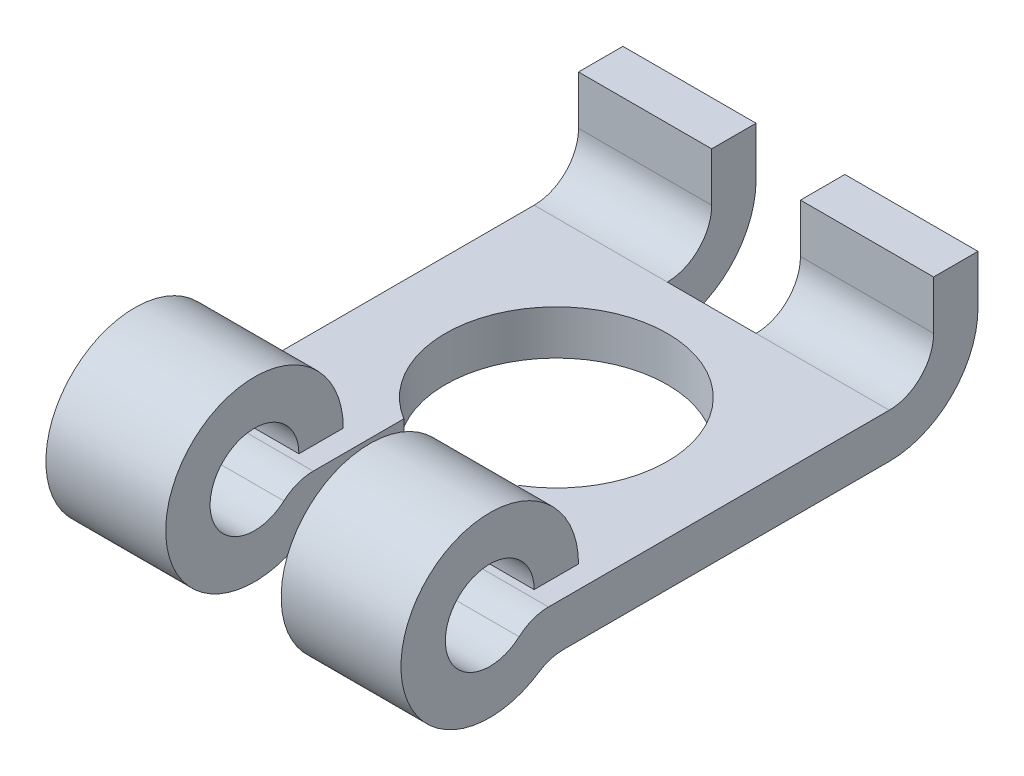
ISO-10303-21;
HEADER;
FILE_DESCRIPTION(('STEP AP214'),'2;1');
FILE_NAME('part.step','',(''),(''),'','','');
FILE_SCHEMA(('AUTOMOTIVE_DESIGN { 1 0 10303 214 1 1 1 1 }'));
ENDSEC;
DATA;
#1=APPLICATION_CONTEXT('core data for automotive mechanical design processes');
#2=APPLICATION_PROTOCOL_DEFINITION('international standard','automotive_design',2000,#1);
#3=PRODUCT_CONTEXT('',#1,'mechanical');
#4=PRODUCT('Part','Part','',(#3));
#5=PRODUCT_RELATED_PRODUCT_CATEGORY('part','',(#4));
#6=PRODUCT_DEFINITION_FORMATION('','',#4);
#7=PRODUCT_DEFINITION_CONTEXT('part definition',#1,'design');
#8=PRODUCT_DEFINITION('design','',#6,#7);
#9=PRODUCT_DEFINITION_SHAPE('','',#8);
#10=(LENGTH_UNIT() NAMED_UNIT(*) SI_UNIT(.MILLI.,.METRE.));
#11=(NAMED_UNIT(*) PLANE_ANGLE_UNIT() SI_UNIT($,.RADIAN.));
#12=(NAMED_UNIT(*) SI_UNIT($,.STERADIAN.) SOLID_ANGLE_UNIT());
#13=UNCERTAINTY_MEASURE_WITH_UNIT(LENGTH_MEASURE(1.E-05),#10,'distance_accuracy_value','');
#14=(GEOMETRIC_REPRESENTATION_CONTEXT(3) GLOBAL_UNCERTAINTY_ASSIGNED_CONTEXT((#13)) GLOBAL_UNIT_ASSIGNED_CONTEXT((#10,
#11,#12)) REPRESENTATION_CONTEXT('',''));
#15=CARTESIAN_POINT('',(0.,0.,0.));
#16=DIRECTION('',(0.,0.,1.));
#17=DIRECTION('',(1.,0.,0.));
#18=AXIS2_PLACEMENT_3D('',#15,#16,#17);
#19=CARTESIAN_POINT('',(80.,0.,-100.));
#20=DIRECTION('',(0.,0.,1.));
#21=DIRECTION('',(1.,0.,0.));
#22=AXIS2_PLACEMENT_3D('',#19,#20,#21);
#23=PLANE('',#22);
#24=DIRECTION('',(0.,1.,0.));
#25=VECTOR('',#24,1.);
#26=CARTESIAN_POINT('',(80.,0.,-100.));
#27=LINE('',#26,#25);
#28=CARTESIAN_POINT('',(80.,20.,-100.));
#29=VERTEX_POINT('',#28);
#30=CARTESIAN_POINT('',(80.,31.,-100.));
#31=VERTEX_POINT('',#30);
#32=EDGE_CURVE('E300',#29,#31,#27,.T.);
#33=ORIENTED_EDGE('',*,*,#32,.F.);
#34=DIRECTION('',(-1.,0.,0.));
#35=VECTOR('',#34,1.);
#36=CARTESIAN_POINT('',(80.,20.,-100.));
#37=LINE('',#36,#35);
#38=CARTESIAN_POINT('',(50.,20.,-100.));
#39=VERTEX_POINT('',#38);
#40=EDGE_CURVE('E374',#29,#39,#37,.T.);
#41=ORIENTED_EDGE('',*,*,#40,.T.);
#42=DIRECTION('',(0.,1.,0.));
#43=VECTOR('',#42,1.);
#44=CARTESIAN_POINT('',(50.,0.,-100.));
#45=LINE('',#44,#43);
#46=CARTESIAN_POINT('',(50.,31.,-100.));
#47=VERTEX_POINT('',#46);
#48=EDGE_CURVE('E346',#39,#47,#45,.T.);
#49=ORIENTED_EDGE('',*,*,#48,.T.);
#50=DIRECTION('',(-1.,0.,0.));
#51=VECTOR('',#50,1.);
#52=CARTESIAN_POINT('',(80.,31.,-100.));
#53=LINE('',#52,#51);
#54=EDGE_CURVE('E254',#31,#47,#53,.T.);
#55=ORIENTED_EDGE('',*,*,#54,.F.);
#56=EDGE_LOOP('',(#33,#41,#49,#55));
#57=FACE_BOUND('',#56,.T.);
#58=ADVANCED_FACE('F35',(#57),#23,.F.);
#59=CARTESIAN_POINT('',(80.,31.,0.));
#60=DIRECTION('',(0.,-1.,0.));
#61=DIRECTION('',(0.,0.,-1.));
#62=AXIS2_PLACEMENT_3D('',#59,#60,#61);
#63=PLANE('',#62);
#64=ORIENTED_EDGE('',*,*,#54,.T.);
#65=DIRECTION('',(0.,0.,1.));
#66=VECTOR('',#65,1.);
#67=CARTESIAN_POINT('',(50.,31.,0.));
#68=LINE('',#67,#66);
#69=CARTESIAN_POINT('',(50.,31.,-90.));
#70=VERTEX_POINT('',#69);
#71=EDGE_CURVE('E348',#47,#70,#68,.T.);
#72=ORIENTED_EDGE('',*,*,#71,.T.);
#73=DIRECTION('',(-1.,0.,0.));
#74=VECTOR('',#73,1.);
#75=CARTESIAN_POINT('',(80.,31.,-90.));
#76=LINE('',#75,#74);
#77=CARTESIAN_POINT('',(80.,31.,-90.));
#78=VERTEX_POINT('',#77);
#79=EDGE_CURVE('E259',#78,#70,#76,.T.);
#80=ORIENTED_EDGE('',*,*,#79,.F.);
#81=DIRECTION('',(0.,0.,1.));
#82=VECTOR('',#81,1.);
#83=CARTESIAN_POINT('',(80.,31.,0.));
#84=LINE('',#83,#82);
#85=EDGE_CURVE('E297',#31,#78,#84,.T.);
#86=ORIENTED_EDGE('',*,*,#85,.F.);
#87=EDGE_LOOP('',(#64,#72,#80,#86));
#88=FACE_BOUND('',#87,.T.);
#89=ADVANCED_FACE('F496',(#88),#63,.F.);
#90=CARTESIAN_POINT('',(80.,0.,-90.));
#91=DIRECTION('',(0.,0.,1.));
#92=DIRECTION('',(1.,0.,0.));
#93=AXIS2_PLACEMENT_3D('',#90,#91,#92);
#94=PLANE('',#93);
#95=DIRECTION('',(0.,1.,0.));
#96=VECTOR('',#95,1.);
#97=CARTESIAN_POINT('',(50.,0.,-90.));
#98=LINE('',#97,#96);
#99=CARTESIAN_POINT('',(50.,20.,-90.));
#100=VERTEX_POINT('',#99);
#101=EDGE_CURVE('E351',#100,#70,#98,.T.);
#102=ORIENTED_EDGE('',*,*,#101,.F.);
#103=DIRECTION('',(-1.,0.,0.));
#104=VECTOR('',#103,1.);
#105=CARTESIAN_POINT('',(80.,20.,-90.));
#106=LINE('',#105,#104);
#107=CARTESIAN_POINT('',(80.,20.,-90.));
#108=VERTEX_POINT('',#107);
#109=EDGE_CURVE('E233',#100,#108,#106,.F.);
#110=ORIENTED_EDGE('',*,*,#109,.T.);
#111=DIRECTION('',(0.,1.,0.));
#112=VECTOR('',#111,1.);
#113=CARTESIAN_POINT('',(80.,0.,-90.));
#114=LINE('',#113,#112);
#115=EDGE_CURVE('E295',#108,#78,#114,.T.);
#116=ORIENTED_EDGE('',*,*,#115,.T.);
#117=ORIENTED_EDGE('',*,*,#79,.T.);
#118=EDGE_LOOP('',(#102,#110,#116,#117));
#119=FACE_BOUND('',#118,.T.);
#120=ADVANCED_FACE('F499',(#119),#94,.T.);
#121=CARTESIAN_POINT('',(80.,20.,-80.));
#122=DIRECTION('',(1.,0.,0.));
#123=DIRECTION('',(0.,0.,-1.));
#124=AXIS2_PLACEMENT_3D('',#121,#122,#123);
#125=CYLINDRICAL_SURFACE('',#124,10.);
#126=ORIENTED_EDGE('',*,*,#109,.F.);
#127=CARTESIAN_POINT('',(50.,20.,-80.));
#128=DIRECTION('',(1.,0.,0.));
#129=DIRECTION('',(0.,0.,-1.));
#130=AXIS2_PLACEMENT_3D('',#127,#128,#129);
#131=CIRCLE('',#130,10.);
#132=CARTESIAN_POINT('',(50.,9.99999999999999,-80.));
#133=VERTEX_POINT('',#132);
#134=EDGE_CURVE('E225',#100,#133,#131,.F.);
#135=ORIENTED_EDGE('',*,*,#134,.T.);
#136=DIRECTION('',(-1.,0.,0.));
#137=VECTOR('',#136,1.);
#138=CARTESIAN_POINT('',(0.,10.,-80.));
#139=LINE('',#138,#137);
#140=CARTESIAN_POINT('',(80.,10.,-80.));
#141=VERTEX_POINT('',#140);
#142=EDGE_CURVE('E218',#141,#133,#139,.T.);
#143=ORIENTED_EDGE('',*,*,#142,.F.);
#144=CARTESIAN_POINT('',(80.,20.,-80.));
#145=DIRECTION('',(1.,0.,0.));
#146=DIRECTION('',(0.,0.,-1.));
#147=AXIS2_PLACEMENT_3D('',#144,#145,#146);
#148=CIRCLE('',#147,10.);
#149=EDGE_CURVE('E416',#108,#141,#148,.F.);
#150=ORIENTED_EDGE('',*,*,#149,.F.);
#151=EDGE_LOOP('',(#126,#135,#143,#150));
#152=FACE_BOUND('',#151,.T.);
#153=ADVANCED_FACE('F231',(#152),#125,.F.);
#154=CARTESIAN_POINT('',(80.,15.,0.));
#155=DIRECTION('',(0.,1.,0.));
#156=DIRECTION('',(0.,0.,1.));
#157=AXIS2_PLACEMENT_3D('',#154,#155,#156);
#158=PLANE('',#157);
#159=DIRECTION('',(0.,0.,1.));
#160=VECTOR('',#159,1.);
#161=CARTESIAN_POINT('',(53.,15.,0.));
#162=LINE('',#161,#160);
#163=CARTESIAN_POINT('',(53.,15.,-10.));
#164=VERTEX_POINT('',#163);
#165=CARTESIAN_POINT('',(53.,15.,0.));
#166=VERTEX_POINT('',#165);
#167=EDGE_CURVE('E316',#164,#166,#162,.T.);
#168=ORIENTED_EDGE('',*,*,#167,.F.);
#169=DIRECTION('',(-1.,0.,0.));
#170=VECTOR('',#169,1.);
#171=CARTESIAN_POINT('',(80.,15.,-10.));
#172=LINE('',#171,#170);
#173=CARTESIAN_POINT('',(80.,15.,-10.));
#174=VERTEX_POINT('',#173);
#175=EDGE_CURVE('E245',#174,#164,#172,.T.);
#176=ORIENTED_EDGE('',*,*,#175,.F.);
#177=DIRECTION('',(0.,0.,-1.));
#178=VECTOR('',#177,1.);
#179=CARTESIAN_POINT('',(80.,15.,0.));
#180=LINE('',#179,#178);
#181=CARTESIAN_POINT('',(80.,15.,0.));
#182=VERTEX_POINT('',#181);
#183=EDGE_CURVE('E270',#182,#174,#180,.T.);
#184=ORIENTED_EDGE('',*,*,#183,.F.);
#185=DIRECTION('',(-1.,0.,0.));
#186=VECTOR('',#185,1.);
#187=CARTESIAN_POINT('',(80.,15.,0.));
#188=LINE('',#187,#186);
#189=EDGE_CURVE('E263',#182,#166,#188,.T.);
#190=ORIENTED_EDGE('',*,*,#189,.T.);
#191=EDGE_LOOP('',(#168,#176,#184,#190));
#192=FACE_BOUND('',#191,.T.);
#193=ADVANCED_FACE('F483',(#192),#158,.F.);
#194=CARTESIAN_POINT('',(80.,15.,10.));
#195=DIRECTION('',(-1.,0.,0.));
#196=DIRECTION('',(0.,0.,1.));
#197=AXIS2_PLACEMENT_3D('',#194,#195,#196);
#198=CYLINDRICAL_SURFACE('',#197,20.);
#199=CARTESIAN_POINT('',(53.,15.,10.));
#200=DIRECTION('',(-1.,0.,0.));
#201=DIRECTION('',(0.,0.,1.));
#202=AXIS2_PLACEMENT_3D('',#199,#200,#201);
#203=CIRCLE('',#202,20.);
#204=CARTESIAN_POINT('',(53.,-1.66666666666667,-1.05541596785134));
#205=VERTEX_POINT('',#204);
#206=EDGE_CURVE('E314',#205,#164,#203,.T.);
#207=ORIENTED_EDGE('',*,*,#206,.F.);
#208=DIRECTION('',(-1.,0.,0.));
#209=VECTOR('',#208,1.);
#210=CARTESIAN_POINT('',(80.,-1.66666666666667,-1.05541596785134));
#211=LINE('',#210,#209);
#212=CARTESIAN_POINT('',(80.,-1.66666666666666,-1.05541596785133));
#213=VERTEX_POINT('',#212);
#214=EDGE_CURVE('E411',#205,#213,#211,.F.);
#215=ORIENTED_EDGE('',*,*,#214,.T.);
#216=CARTESIAN_POINT('',(80.,15.,10.));
#217=DIRECTION('',(1.,0.,0.));
#218=DIRECTION('',(0.,0.,-1.));
#219=AXIS2_PLACEMENT_3D('',#216,#217,#218);
#220=CIRCLE('',#219,20.);
#221=EDGE_CURVE('E304',#174,#213,#220,.T.);
#222=ORIENTED_EDGE('',*,*,#221,.F.);
#223=ORIENTED_EDGE('',*,*,#175,.T.);
#224=EDGE_LOOP('',(#207,#215,#222,#223));
#225=FACE_BOUND('',#224,.T.);
#226=ADVANCED_FACE('F525',(#225),#198,.T.);
#227=CARTESIAN_POINT('',(80.,0.,0.));
#228=DIRECTION('',(0.,1.,0.));
#229=DIRECTION('',(0.,0.,1.));
#230=AXIS2_PLACEMENT_3D('',#227,#228,#229);
#231=PLANE('',#230);
#232=DIRECTION('',(0.,0.,-1.));
#233=VECTOR('',#232,1.);
#234=CARTESIAN_POINT('',(0.,0.,0.));
#235=LINE('',#234,#233);
#236=CARTESIAN_POINT('',(0.,0.,-6.583123951777));
#237=VERTEX_POINT('',#236);
#238=CARTESIAN_POINT('',(0.,0.,-80.));
#239=VERTEX_POINT('',#238);
#240=EDGE_CURVE('E281',#237,#239,#235,.T.);
#241=ORIENTED_EDGE('',*,*,#240,.T.);
#242=DIRECTION('',(-1.,0.,0.));
#243=VECTOR('',#242,1.);
#244=CARTESIAN_POINT('',(80.,0.,-80.));
#245=LINE('',#244,#243);
#246=CARTESIAN_POINT('',(30.,0.,-80.));
#247=VERTEX_POINT('',#246);
#248=EDGE_CURVE('E372',#239,#247,#245,.F.);
#249=ORIENTED_EDGE('',*,*,#248,.T.);
#250=DIRECTION('',(-1.,0.,0.));
#251=VECTOR('',#250,1.);
#252=CARTESIAN_POINT('',(80.,0.,-80.));
#253=LINE('',#252,#251);
#254=CARTESIAN_POINT('',(50.,0.,-80.));
#255=VERTEX_POINT('',#254);
#256=EDGE_CURVE('E361',#255,#247,#253,.T.);
#257=ORIENTED_EDGE('',*,*,#256,.F.);
#258=DIRECTION('',(-1.,0.,0.));
#259=VECTOR('',#258,1.);
#260=CARTESIAN_POINT('',(80.,0.,-80.));
#261=LINE('',#260,#259);
#262=CARTESIAN_POINT('',(80.,0.,-80.));
#263=VERTEX_POINT('',#262);
#264=EDGE_CURVE('E377',#255,#263,#261,.F.);
#265=ORIENTED_EDGE('',*,*,#264,.T.);
#266=DIRECTION('',(0.,0.,-1.));
#267=VECTOR('',#266,1.);
#268=CARTESIAN_POINT('',(80.,0.,0.));
#269=LINE('',#268,#267);
#270=CARTESIAN_POINT('',(80.,0.,-6.583123951777));
#271=VERTEX_POINT('',#270);
#272=EDGE_CURVE('E302',#271,#263,#269,.T.);
#273=ORIENTED_EDGE('',*,*,#272,.F.);
#274=DIRECTION('',(1.,0.,0.));
#275=VECTOR('',#274,1.);
#276=CARTESIAN_POINT('',(0.,0.,-6.583123951777));
#277=LINE('',#276,#275);
#278=CARTESIAN_POINT('',(53.,0.,-6.583123951777));
#279=VERTEX_POINT('',#278);
#280=EDGE_CURVE('E412',#271,#279,#277,.F.);
#281=ORIENTED_EDGE('',*,*,#280,.T.);
#282=DIRECTION('',(0.,0.,1.));
#283=VECTOR('',#282,1.);
#284=CARTESIAN_POINT('',(53.,0.,0.));
#285=LINE('',#284,#283);
#286=CARTESIAN_POINT('',(53.,0.,-23.6458434959374));
#287=VERTEX_POINT('',#286);
#288=EDGE_CURVE('E310',#287,#279,#285,.T.);
#289=ORIENTED_EDGE('',*,*,#288,.F.);
#290=CARTESIAN_POINT('',(40.,0.,-45.));
#291=DIRECTION('',(0.,1.,0.));
#292=DIRECTION('',(0.,0.,1.));
#293=AXIS2_PLACEMENT_3D('',#290,#291,#292);
#294=CIRCLE('',#293,25.);
#295=CARTESIAN_POINT('',(27.,0.,-23.6458434959374));
#296=VERTEX_POINT('',#295);
#297=EDGE_CURVE('E290',#296,#287,#294,.F.);
#298=ORIENTED_EDGE('',*,*,#297,.F.);
#299=DIRECTION('',(0.,0.,1.));
#300=VECTOR('',#299,1.);
#301=CARTESIAN_POINT('',(27.,0.,0.));
#302=LINE('',#301,#300);
#303=CARTESIAN_POINT('',(27.,0.,-6.583123951777));
#304=VERTEX_POINT('',#303);
#305=EDGE_CURVE('E324',#296,#304,#302,.T.);
#306=ORIENTED_EDGE('',*,*,#305,.T.);
#307=EDGE_CURVE('E415',#304,#237,#277,.F.);
#308=ORIENTED_EDGE('',*,*,#307,.T.);
#309=EDGE_LOOP('',(#241,#249,#257,#265,#273,#281,#289,#298,#306,#308));
#310=FACE_BOUND('',#309,.T.);
#311=ADVANCED_FACE('F463',(#310),#231,.F.);
#312=CARTESIAN_POINT('',(80.,10.,0.));
#313=DIRECTION('',(0.,1.,0.));
#314=DIRECTION('',(0.,0.,1.));
#315=AXIS2_PLACEMENT_3D('',#312,#313,#314);
#316=PLANE('',#315);
#317=CARTESIAN_POINT('',(40.,10.,-45.));
#318=DIRECTION('',(0.,1.,0.));
#319=DIRECTION('',(0.,0.,1.));
#320=AXIS2_PLACEMENT_3D('',#317,#318,#319);
#321=CIRCLE('',#320,25.);
#322=CARTESIAN_POINT('',(27.,10.,-23.6458434959374));
#323=VERTEX_POINT('',#322);
#324=CARTESIAN_POINT('',(53.,10.,-23.6458434959374));
#325=VERTEX_POINT('',#324);
#326=EDGE_CURVE('E385',#323,#325,#321,.F.);
#327=ORIENTED_EDGE('',*,*,#326,.T.);
#328=DIRECTION('',(0.,0.,1.));
#329=VECTOR('',#328,1.);
#330=CARTESIAN_POINT('',(53.,10.,0.));
#331=LINE('',#330,#329);
#332=CARTESIAN_POINT('',(53.,10.,-3.22875655532295));
#333=VERTEX_POINT('',#332);
#334=EDGE_CURVE('E318',#325,#333,#331,.T.);
#335=ORIENTED_EDGE('',*,*,#334,.T.);
#336=DIRECTION('',(-1.,0.,0.));
#337=VECTOR('',#336,1.);
#338=CARTESIAN_POINT('',(80.,10.,-3.22875655532295));
#339=LINE('',#338,#337);
#340=CARTESIAN_POINT('',(80.,10.,-3.22875655532295));
#341=VERTEX_POINT('',#340);
#342=EDGE_CURVE('E401',#333,#341,#339,.F.);
#343=ORIENTED_EDGE('',*,*,#342,.T.);
#344=DIRECTION('',(0.,0.,-1.));
#345=VECTOR('',#344,1.);
#346=CARTESIAN_POINT('',(80.,10.,0.));
#347=LINE('',#346,#345);
#348=EDGE_CURVE('E240',#341,#141,#347,.T.);
#349=ORIENTED_EDGE('',*,*,#348,.T.);
#350=ORIENTED_EDGE('',*,*,#142,.T.);
#351=CARTESIAN_POINT('',(30.,10.,-80.));
#352=VERTEX_POINT('',#351);
#353=EDGE_CURVE('E207',#133,#352,#139,.T.);
#354=ORIENTED_EDGE('',*,*,#353,.T.);
#355=CARTESIAN_POINT('',(0.,10.,-80.));
#356=VERTEX_POINT('',#355);
#357=EDGE_CURVE('E219',#352,#356,#139,.T.);
#358=ORIENTED_EDGE('',*,*,#357,.T.);
#359=DIRECTION('',(0.,0.,-1.));
#360=VECTOR('',#359,1.);
#361=CARTESIAN_POINT('',(0.,10.,0.));
#362=LINE('',#361,#360);
#363=CARTESIAN_POINT('',(0.,10.,-3.22875655532295));
#364=VERTEX_POINT('',#363);
#365=EDGE_CURVE('E271',#364,#356,#362,.T.);
#366=ORIENTED_EDGE('',*,*,#365,.F.);
#367=CARTESIAN_POINT('',(27.,10.,-3.22875655532295));
#368=VERTEX_POINT('',#367);
#369=EDGE_CURVE('E398',#364,#368,#339,.F.);
#370=ORIENTED_EDGE('',*,*,#369,.T.);
#371=DIRECTION('',(0.,0.,1.));
#372=VECTOR('',#371,1.);
#373=CARTESIAN_POINT('',(27.,10.,0.));
#374=LINE('',#373,#372);
#375=EDGE_CURVE('E336',#323,#368,#374,.T.);
#376=ORIENTED_EDGE('',*,*,#375,.F.);
#377=EDGE_LOOP('',(#327,#335,#343,#349,#350,#354,#358,#366,#370,#376));
#378=FACE_BOUND('',#377,.T.);
#379=ADVANCED_FACE('F238',(#378),#316,.T.);
#380=CARTESIAN_POINT('',(80.,15.,10.));
#381=DIRECTION('',(-1.,0.,0.));
#382=DIRECTION('',(0.,0.,1.));
#383=AXIS2_PLACEMENT_3D('',#380,#381,#382);
#384=CYLINDRICAL_SURFACE('',#383,10.);
#385=DIRECTION('',(-1.,0.,0.));
#386=VECTOR('',#385,1.);
#387=CARTESIAN_POINT('',(80.,7.5,3.38562172233852));
#388=LINE('',#387,#386);
#389=CARTESIAN_POINT('',(80.,7.5,3.38562172233852));
#390=VERTEX_POINT('',#389);
#391=CARTESIAN_POINT('',(53.,7.5,3.38562172233853));
#392=VERTEX_POINT('',#391);
#393=EDGE_CURVE('E404',#390,#392,#388,.T.);
#394=ORIENTED_EDGE('',*,*,#393,.T.);
#395=CARTESIAN_POINT('',(53.,15.,10.));
#396=DIRECTION('',(-1.,0.,0.));
#397=DIRECTION('',(0.,0.,1.));
#398=AXIS2_PLACEMENT_3D('',#395,#396,#397);
#399=CIRCLE('',#398,10.);
#400=EDGE_CURVE('E321',#392,#166,#399,.T.);
#401=ORIENTED_EDGE('',*,*,#400,.T.);
#402=ORIENTED_EDGE('',*,*,#189,.F.);
#403=CARTESIAN_POINT('',(80.,15.,10.));
#404=DIRECTION('',(1.,0.,0.));
#405=DIRECTION('',(0.,0.,-1.));
#406=AXIS2_PLACEMENT_3D('',#403,#404,#405);
#407=CIRCLE('',#406,10.);
#408=EDGE_CURVE('E291',#182,#390,#407,.T.);
#409=ORIENTED_EDGE('',*,*,#408,.T.);
#410=EDGE_LOOP('',(#394,#401,#402,#409));
#411=FACE_BOUND('',#410,.T.);
#412=ADVANCED_FACE('F479',(#411),#384,.F.);
#413=CARTESIAN_POINT('',(80.,-10.,-6.583123951777));
#414=DIRECTION('',(-1.,0.,0.));
#415=DIRECTION('',(0.,0.,1.));
#416=AXIS2_PLACEMENT_3D('',#413,#414,#415);
#417=CYLINDRICAL_SURFACE('',#416,10.);
#418=CARTESIAN_POINT('',(53.,-10.,-6.583123951777));
#419=DIRECTION('',(-1.,0.,0.));
#420=DIRECTION('',(0.,0.,1.));
#421=AXIS2_PLACEMENT_3D('',#418,#419,#420);
#422=CIRCLE('',#421,10.);
#423=EDGE_CURVE('E312',#279,#205,#422,.F.);
#424=ORIENTED_EDGE('',*,*,#423,.F.);
#425=ORIENTED_EDGE('',*,*,#280,.F.);
#426=CARTESIAN_POINT('',(80.,-10.,-6.583123951777));
#427=DIRECTION('',(1.,0.,0.));
#428=DIRECTION('',(0.,0.,-1.));
#429=AXIS2_PLACEMENT_3D('',#426,#427,#428);
#430=CIRCLE('',#429,10.);
#431=EDGE_CURVE('E392',#213,#271,#430,.F.);
#432=ORIENTED_EDGE('',*,*,#431,.F.);
#433=ORIENTED_EDGE('',*,*,#214,.F.);
#434=EDGE_LOOP('',(#424,#425,#432,#433));
#435=FACE_BOUND('',#434,.T.);
#436=ADVANCED_FACE('F489',(#435),#417,.F.);
#437=CARTESIAN_POINT('',(80.,0.,-3.22875655532295));
#438=DIRECTION('',(-1.,0.,0.));
#439=DIRECTION('',(0.,0.,1.));
#440=AXIS2_PLACEMENT_3D('',#437,#438,#439);
#441=CYLINDRICAL_SURFACE('',#440,10.);
#442=ORIENTED_EDGE('',*,*,#342,.F.);
#443=CARTESIAN_POINT('',(53.,0.,-3.22875655532295));
#444=DIRECTION('',(-1.,0.,0.));
#445=DIRECTION('',(0.,0.,1.));
#446=AXIS2_PLACEMENT_3D('',#443,#444,#445);
#447=CIRCLE('',#446,10.);
#448=EDGE_CURVE('E387',#333,#392,#447,.F.);
#449=ORIENTED_EDGE('',*,*,#448,.T.);
#450=ORIENTED_EDGE('',*,*,#393,.F.);
#451=CARTESIAN_POINT('',(80.,0.,-3.22875655532295));
#452=DIRECTION('',(1.,0.,0.));
#453=DIRECTION('',(0.,0.,-1.));
#454=AXIS2_PLACEMENT_3D('',#451,#452,#453);
#455=CIRCLE('',#454,10.);
#456=EDGE_CURVE('E396',#341,#390,#455,.T.);
#457=ORIENTED_EDGE('',*,*,#456,.F.);
#458=EDGE_LOOP('',(#442,#449,#450,#457));
#459=FACE_BOUND('',#458,.T.);
#460=ADVANCED_FACE('F474',(#459),#441,.T.);
#461=CARTESIAN_POINT('',(27.,15.,-10.));
#462=VERTEX_POINT('',#461);
#463=CARTESIAN_POINT('',(0.,15.,-10.));
#464=VERTEX_POINT('',#463);
#465=EDGE_CURVE('E250',#462,#464,#172,.T.);
#466=ORIENTED_EDGE('',*,*,#465,.F.);
#467=DIRECTION('',(0.,0.,1.));
#468=VECTOR('',#467,1.);
#469=CARTESIAN_POINT('',(27.,15.,0.));
#470=LINE('',#469,#468);
#471=CARTESIAN_POINT('',(27.,15.,0.));
#472=VERTEX_POINT('',#471);
#473=EDGE_CURVE('E333',#462,#472,#470,.T.);
#474=ORIENTED_EDGE('',*,*,#473,.T.);
#475=CARTESIAN_POINT('',(0.,15.,0.));
#476=VERTEX_POINT('',#475);
#477=EDGE_CURVE('E266',#472,#476,#188,.T.);
#478=ORIENTED_EDGE('',*,*,#477,.T.);
#479=DIRECTION('',(0.,0.,-1.));
#480=VECTOR('',#479,1.);
#481=CARTESIAN_POINT('',(0.,15.,0.));
#482=LINE('',#481,#480);
#483=EDGE_CURVE('E287',#476,#464,#482,.T.);
#484=ORIENTED_EDGE('',*,*,#483,.T.);
#485=EDGE_LOOP('',(#466,#474,#478,#484));
#486=FACE_BOUND('',#485,.T.);
#487=ADVANCED_FACE('F451',(#486),#158,.F.);
#488=CARTESIAN_POINT('',(0.,-1.66666666666666,-1.05541596785133));
#489=VERTEX_POINT('',#488);
#490=CARTESIAN_POINT('',(27.,-1.66666666666667,-1.05541596785134));
#491=VERTEX_POINT('',#490);
#492=EDGE_CURVE('E408',#489,#491,#211,.F.);
#493=ORIENTED_EDGE('',*,*,#492,.T.);
#494=CARTESIAN_POINT('',(27.,15.,10.));
#495=DIRECTION('',(-1.,0.,0.));
#496=DIRECTION('',(0.,0.,1.));
#497=AXIS2_PLACEMENT_3D('',#494,#495,#496);
#498=CIRCLE('',#497,20.);
#499=EDGE_CURVE('E330',#491,#462,#498,.T.);
#500=ORIENTED_EDGE('',*,*,#499,.T.);
#501=ORIENTED_EDGE('',*,*,#465,.T.);
#502=CARTESIAN_POINT('',(0.,15.,10.));
#503=DIRECTION('',(1.,0.,0.));
#504=DIRECTION('',(0.,0.,-1.));
#505=AXIS2_PLACEMENT_3D('',#502,#503,#504);
#506=CIRCLE('',#505,20.);
#507=EDGE_CURVE('E284',#464,#489,#506,.T.);
#508=ORIENTED_EDGE('',*,*,#507,.T.);
#509=EDGE_LOOP('',(#493,#500,#501,#508));
#510=FACE_BOUND('',#509,.T.);
#511=ADVANCED_FACE('F457',(#510),#198,.T.);
#512=DIRECTION('',(0.,-1.,0.));
#513=VECTOR('',#512,1.);
#514=CARTESIAN_POINT('',(30.,0.,-100.));
#515=LINE('',#514,#513);
#516=CARTESIAN_POINT('',(30.,31.,-100.));
#517=VERTEX_POINT('',#516);
#518=CARTESIAN_POINT('',(30.,20.,-100.));
#519=VERTEX_POINT('',#518);
#520=EDGE_CURVE('E353',#517,#519,#515,.T.);
#521=ORIENTED_EDGE('',*,*,#520,.T.);
#522=DIRECTION('',(-1.,0.,0.));
#523=VECTOR('',#522,1.);
#524=CARTESIAN_POINT('',(80.,20.,-100.));
#525=LINE('',#524,#523);
#526=CARTESIAN_POINT('',(0.,20.,-100.));
#527=VERTEX_POINT('',#526);
#528=EDGE_CURVE('E234',#519,#527,#525,.T.);
#529=ORIENTED_EDGE('',*,*,#528,.T.);
#530=DIRECTION('',(0.,1.,0.));
#531=VECTOR('',#530,1.);
#532=CARTESIAN_POINT('',(0.,0.,-100.));
#533=LINE('',#532,#531);
#534=CARTESIAN_POINT('',(0.,31.,-100.));
#535=VERTEX_POINT('',#534);
#536=EDGE_CURVE('E279',#527,#535,#533,.T.);
#537=ORIENTED_EDGE('',*,*,#536,.T.);
#538=EDGE_CURVE('E258',#517,#535,#53,.T.);
#539=ORIENTED_EDGE('',*,*,#538,.F.);
#540=EDGE_LOOP('',(#521,#529,#537,#539));
#541=FACE_BOUND('',#540,.T.);
#542=ADVANCED_FACE('F513',(#541),#23,.F.);
#543=CARTESIAN_POINT('',(30.,31.,-90.));
#544=VERTEX_POINT('',#543);
#545=CARTESIAN_POINT('',(0.,31.,-90.));
#546=VERTEX_POINT('',#545);
#547=EDGE_CURVE('E262',#544,#546,#76,.T.);
#548=ORIENTED_EDGE('',*,*,#547,.F.);
#549=DIRECTION('',(0.,0.,-1.));
#550=VECTOR('',#549,1.);
#551=CARTESIAN_POINT('',(30.,31.,0.));
#552=LINE('',#551,#550);
#553=EDGE_CURVE('E356',#544,#517,#552,.T.);
#554=ORIENTED_EDGE('',*,*,#553,.T.);
#555=ORIENTED_EDGE('',*,*,#538,.T.);
#556=DIRECTION('',(0.,0.,1.));
#557=VECTOR('',#556,1.);
#558=CARTESIAN_POINT('',(0.,31.,0.));
#559=LINE('',#558,#557);
#560=EDGE_CURVE('E276',#535,#546,#559,.T.);
#561=ORIENTED_EDGE('',*,*,#560,.T.);
#562=EDGE_LOOP('',(#548,#554,#555,#561));
#563=FACE_BOUND('',#562,.T.);
#564=ADVANCED_FACE('F508',(#563),#63,.F.);
#565=DIRECTION('',(0.,-1.,0.));
#566=VECTOR('',#565,1.);
#567=CARTESIAN_POINT('',(30.,0.,-90.));
#568=LINE('',#567,#566);
#569=CARTESIAN_POINT('',(30.,20.,-90.));
#570=VERTEX_POINT('',#569);
#571=EDGE_CURVE('E359',#544,#570,#568,.T.);
#572=ORIENTED_EDGE('',*,*,#571,.F.);
#573=ORIENTED_EDGE('',*,*,#547,.T.);
#574=DIRECTION('',(0.,1.,0.));
#575=VECTOR('',#574,1.);
#576=CARTESIAN_POINT('',(0.,0.,-90.));
#577=LINE('',#576,#575);
#578=CARTESIAN_POINT('',(0.,20.,-90.));
#579=VERTEX_POINT('',#578);
#580=EDGE_CURVE('E273',#579,#546,#577,.T.);
#581=ORIENTED_EDGE('',*,*,#580,.F.);
#582=EDGE_CURVE('E242',#579,#570,#106,.F.);
#583=ORIENTED_EDGE('',*,*,#582,.T.);
#584=EDGE_LOOP('',(#572,#573,#581,#583));
#585=FACE_BOUND('',#584,.T.);
#586=ADVANCED_FACE('F424',(#585),#94,.T.);
#587=CARTESIAN_POINT('',(27.,15.,10.));
#588=DIRECTION('',(-1.,0.,0.));
#589=DIRECTION('',(0.,0.,1.));
#590=AXIS2_PLACEMENT_3D('',#587,#588,#589);
#591=CIRCLE('',#590,10.);
#592=CARTESIAN_POINT('',(27.,7.5,3.38562172233853));
#593=VERTEX_POINT('',#592);
#594=EDGE_CURVE('E338',#593,#472,#591,.T.);
#595=ORIENTED_EDGE('',*,*,#594,.F.);
#596=CARTESIAN_POINT('',(0.,7.5,3.38562172233852));
#597=VERTEX_POINT('',#596);
#598=EDGE_CURVE('E407',#593,#597,#388,.T.);
#599=ORIENTED_EDGE('',*,*,#598,.T.);
#600=CARTESIAN_POINT('',(0.,15.,10.));
#601=DIRECTION('',(1.,0.,0.));
#602=DIRECTION('',(0.,0.,-1.));
#603=AXIS2_PLACEMENT_3D('',#600,#601,#602);
#604=CIRCLE('',#603,10.);
#605=EDGE_CURVE('E267',#476,#597,#604,.T.);
#606=ORIENTED_EDGE('',*,*,#605,.F.);
#607=ORIENTED_EDGE('',*,*,#477,.F.);
#608=EDGE_LOOP('',(#595,#599,#606,#607));
#609=FACE_BOUND('',#608,.T.);
#610=ADVANCED_FACE('F446',(#609),#384,.F.);
#611=CARTESIAN_POINT('',(80.,0.,0.));
#612=DIRECTION('',(1.,0.,0.));
#613=DIRECTION('',(0.,0.,-1.));
#614=AXIS2_PLACEMENT_3D('',#611,#612,#613);
#615=PLANE('',#614);
#616=ORIENTED_EDGE('',*,*,#272,.T.);
#617=CARTESIAN_POINT('',(80.,20.,-80.));
#618=DIRECTION('',(1.,0.,0.));
#619=DIRECTION('',(0.,0.,-1.));
#620=AXIS2_PLACEMENT_3D('',#617,#618,#619);
#621=CIRCLE('',#620,20.);
#622=EDGE_CURVE('E11',#263,#29,#621,.T.);
#623=ORIENTED_EDGE('',*,*,#622,.T.);
#624=ORIENTED_EDGE('',*,*,#32,.T.);
#625=ORIENTED_EDGE('',*,*,#85,.T.);
#626=ORIENTED_EDGE('',*,*,#115,.F.);
#627=ORIENTED_EDGE('',*,*,#149,.T.);
#628=ORIENTED_EDGE('',*,*,#348,.F.);
#629=ORIENTED_EDGE('',*,*,#456,.T.);
#630=ORIENTED_EDGE('',*,*,#408,.F.);
#631=ORIENTED_EDGE('',*,*,#183,.T.);
#632=ORIENTED_EDGE('',*,*,#221,.T.);
#633=ORIENTED_EDGE('',*,*,#431,.T.);
#634=EDGE_LOOP('',(#616,#623,#624,#625,#626,#627,#628,#629,#630,#631,#632,#633));
#635=FACE_BOUND('',#634,.T.);
#636=ADVANCED_FACE('F477',(#635),#615,.T.);
#637=CARTESIAN_POINT('',(0.,0.,0.));
#638=DIRECTION('',(1.,0.,0.));
#639=DIRECTION('',(0.,0.,-1.));
#640=AXIS2_PLACEMENT_3D('',#637,#638,#639);
#641=PLANE('',#640);
#642=ORIENTED_EDGE('',*,*,#536,.F.);
#643=CARTESIAN_POINT('',(0.,20.,-80.));
#644=DIRECTION('',(1.,0.,0.));
#645=DIRECTION('',(0.,0.,-1.));
#646=AXIS2_PLACEMENT_3D('',#643,#644,#645);
#647=CIRCLE('',#646,20.);
#648=EDGE_CURVE('E381',#527,#239,#647,.F.);
#649=ORIENTED_EDGE('',*,*,#648,.T.);
#650=ORIENTED_EDGE('',*,*,#240,.F.);
#651=CARTESIAN_POINT('',(0.,-10.,-6.583123951777));
#652=DIRECTION('',(1.,0.,0.));
#653=DIRECTION('',(0.,0.,-1.));
#654=AXIS2_PLACEMENT_3D('',#651,#652,#653);
#655=CIRCLE('',#654,10.);
#656=EDGE_CURVE('E394',#237,#489,#655,.T.);
#657=ORIENTED_EDGE('',*,*,#656,.T.);
#658=ORIENTED_EDGE('',*,*,#507,.F.);
#659=ORIENTED_EDGE('',*,*,#483,.F.);
#660=ORIENTED_EDGE('',*,*,#605,.T.);
#661=CARTESIAN_POINT('',(0.,0.,-3.22875655532295));
#662=DIRECTION('',(1.,0.,0.));
#663=DIRECTION('',(0.,0.,-1.));
#664=AXIS2_PLACEMENT_3D('',#661,#662,#663);
#665=CIRCLE('',#664,10.);
#666=EDGE_CURVE('E402',#597,#364,#665,.F.);
#667=ORIENTED_EDGE('',*,*,#666,.T.);
#668=ORIENTED_EDGE('',*,*,#365,.T.);
#669=CARTESIAN_POINT('',(0.,20.,-80.));
#670=DIRECTION('',(1.,0.,0.));
#671=DIRECTION('',(0.,0.,-1.));
#672=AXIS2_PLACEMENT_3D('',#669,#670,#671);
#673=CIRCLE('',#672,10.);
#674=EDGE_CURVE('E418',#356,#579,#673,.T.);
#675=ORIENTED_EDGE('',*,*,#674,.T.);
#676=ORIENTED_EDGE('',*,*,#580,.T.);
#677=ORIENTED_EDGE('',*,*,#560,.F.);
#678=EDGE_LOOP('',(#642,#649,#650,#657,#658,#659,#660,#667,#668,#675,#676,#677));
#679=FACE_BOUND('',#678,.T.);
#680=ADVANCED_FACE('F431',(#679),#641,.F.);
#681=ORIENTED_EDGE('',*,*,#357,.F.);
#682=CARTESIAN_POINT('',(30.,20.,-80.));
#683=DIRECTION('',(-1.,0.,0.));
#684=DIRECTION('',(0.,0.,1.));
#685=AXIS2_PLACEMENT_3D('',#682,#683,#684);
#686=CIRCLE('',#685,10.);
#687=EDGE_CURVE('E235',#352,#570,#686,.F.);
#688=ORIENTED_EDGE('',*,*,#687,.T.);
#689=ORIENTED_EDGE('',*,*,#582,.F.);
#690=ORIENTED_EDGE('',*,*,#674,.F.);
#691=EDGE_LOOP('',(#681,#688,#689,#690));
#692=FACE_BOUND('',#691,.T.);
#693=ADVANCED_FACE('F428',(#692),#125,.F.);
#694=ORIENTED_EDGE('',*,*,#307,.F.);
#695=CARTESIAN_POINT('',(27.,-10.,-6.583123951777));
#696=DIRECTION('',(-1.,0.,0.));
#697=DIRECTION('',(0.,0.,1.));
#698=AXIS2_PLACEMENT_3D('',#695,#696,#697);
#699=CIRCLE('',#698,10.);
#700=EDGE_CURVE('E327',#304,#491,#699,.F.);
#701=ORIENTED_EDGE('',*,*,#700,.T.);
#702=ORIENTED_EDGE('',*,*,#492,.F.);
#703=ORIENTED_EDGE('',*,*,#656,.F.);
#704=EDGE_LOOP('',(#694,#701,#702,#703));
#705=FACE_BOUND('',#704,.T.);
#706=ADVANCED_FACE('F460',(#705),#417,.F.);
#707=CARTESIAN_POINT('',(27.,0.,-3.22875655532295));
#708=DIRECTION('',(-1.,0.,0.));
#709=DIRECTION('',(0.,0.,1.));
#710=AXIS2_PLACEMENT_3D('',#707,#708,#709);
#711=CIRCLE('',#710,10.);
#712=EDGE_CURVE('E390',#368,#593,#711,.F.);
#713=ORIENTED_EDGE('',*,*,#712,.F.);
#714=ORIENTED_EDGE('',*,*,#369,.F.);
#715=ORIENTED_EDGE('',*,*,#666,.F.);
#716=ORIENTED_EDGE('',*,*,#598,.F.);
#717=EDGE_LOOP('',(#713,#714,#715,#716));
#718=FACE_BOUND('',#717,.T.);
#719=ADVANCED_FACE('F438',(#718),#441,.T.);
#720=CARTESIAN_POINT('',(40.,40.,-45.));
#721=DIRECTION('',(0.,-1.,0.));
#722=DIRECTION('',(0.,0.,-1.));
#723=AXIS2_PLACEMENT_3D('',#720,#721,#722);
#724=CYLINDRICAL_SURFACE('',#723,25.);
#725=ORIENTED_EDGE('',*,*,#297,.T.);
#726=DIRECTION('',(0.,-1.,0.));
#727=VECTOR('',#726,1.);
#728=CARTESIAN_POINT('',(53.,40.,-23.6458434959374));
#729=LINE('',#728,#727);
#730=EDGE_CURVE('E340',#325,#287,#729,.T.);
#731=ORIENTED_EDGE('',*,*,#730,.F.);
#732=ORIENTED_EDGE('',*,*,#326,.F.);
#733=DIRECTION('',(0.,-1.,0.));
#734=VECTOR('',#733,1.);
#735=CARTESIAN_POINT('',(27.,40.,-23.6458434959374));
#736=LINE('',#735,#734);
#737=EDGE_CURVE('E343',#323,#296,#736,.T.);
#738=ORIENTED_EDGE('',*,*,#737,.T.);
#739=EDGE_LOOP('',(#725,#731,#732,#738));
#740=FACE_BOUND('',#739,.T.);
#741=ADVANCED_FACE('F467',(#740),#724,.F.);
#742=CARTESIAN_POINT('',(53.,40.,0.));
#743=DIRECTION('',(-1.,0.,0.));
#744=DIRECTION('',(0.,0.,1.));
#745=AXIS2_PLACEMENT_3D('',#742,#743,#744);
#746=PLANE('',#745);
#747=ORIENTED_EDGE('',*,*,#288,.T.);
#748=ORIENTED_EDGE('',*,*,#423,.T.);
#749=ORIENTED_EDGE('',*,*,#206,.T.);
#750=ORIENTED_EDGE('',*,*,#167,.T.);
#751=ORIENTED_EDGE('',*,*,#400,.F.);
#752=ORIENTED_EDGE('',*,*,#448,.F.);
#753=ORIENTED_EDGE('',*,*,#334,.F.);
#754=ORIENTED_EDGE('',*,*,#730,.T.);
#755=EDGE_LOOP('',(#747,#748,#749,#750,#751,#752,#753,#754));
#756=FACE_BOUND('',#755,.T.);
#757=ADVANCED_FACE('F469',(#756),#746,.T.);
#758=CARTESIAN_POINT('',(27.,40.,0.));
#759=DIRECTION('',(-1.,0.,0.));
#760=DIRECTION('',(0.,0.,1.));
#761=AXIS2_PLACEMENT_3D('',#758,#759,#760);
#762=PLANE('',#761);
#763=ORIENTED_EDGE('',*,*,#737,.F.);
#764=ORIENTED_EDGE('',*,*,#375,.T.);
#765=ORIENTED_EDGE('',*,*,#712,.T.);
#766=ORIENTED_EDGE('',*,*,#594,.T.);
#767=ORIENTED_EDGE('',*,*,#473,.F.);
#768=ORIENTED_EDGE('',*,*,#499,.F.);
#769=ORIENTED_EDGE('',*,*,#700,.F.);
#770=ORIENTED_EDGE('',*,*,#305,.F.);
#771=EDGE_LOOP('',(#763,#764,#765,#766,#767,#768,#769,#770));
#772=FACE_BOUND('',#771,.T.);
#773=ADVANCED_FACE('F443',(#772),#762,.F.);
#774=CARTESIAN_POINT('',(50.,40.,0.));
#775=DIRECTION('',(1.,0.,0.));
#776=DIRECTION('',(0.,0.,-1.));
#777=AXIS2_PLACEMENT_3D('',#774,#775,#776);
#778=PLANE('',#777);
#779=ORIENTED_EDGE('',*,*,#48,.F.);
#780=CARTESIAN_POINT('',(50.,20.,-80.));
#781=DIRECTION('',(1.,0.,0.));
#782=DIRECTION('',(0.,0.,-1.));
#783=AXIS2_PLACEMENT_3D('',#780,#781,#782);
#784=CIRCLE('',#783,20.);
#785=EDGE_CURVE('E43',#39,#255,#784,.F.);
#786=ORIENTED_EDGE('',*,*,#785,.T.);
#787=DIRECTION('',(0.,-1.,0.));
#788=VECTOR('',#787,1.);
#789=CARTESIAN_POINT('',(50.,40.,-80.));
#790=LINE('',#789,#788);
#791=EDGE_CURVE('E211',#133,#255,#790,.T.);
#792=ORIENTED_EDGE('',*,*,#791,.F.);
#793=ORIENTED_EDGE('',*,*,#134,.F.);
#794=ORIENTED_EDGE('',*,*,#101,.T.);
#795=ORIENTED_EDGE('',*,*,#71,.F.);
#796=EDGE_LOOP('',(#779,#786,#792,#793,#794,#795));
#797=FACE_BOUND('',#796,.T.);
#798=ADVANCED_FACE('F224',(#797),#778,.F.);
#799=CARTESIAN_POINT('',(30.,40.,0.));
#800=DIRECTION('',(-1.,0.,0.));
#801=DIRECTION('',(0.,0.,1.));
#802=AXIS2_PLACEMENT_3D('',#799,#800,#801);
#803=PLANE('',#802);
#804=DIRECTION('',(0.,-1.,0.));
#805=VECTOR('',#804,1.);
#806=CARTESIAN_POINT('',(30.,40.,-80.));
#807=LINE('',#806,#805);
#808=EDGE_CURVE('E214',#352,#247,#807,.T.);
#809=ORIENTED_EDGE('',*,*,#808,.T.);
#810=CARTESIAN_POINT('',(30.,20.,-80.));
#811=DIRECTION('',(-1.,0.,0.));
#812=DIRECTION('',(0.,0.,1.));
#813=AXIS2_PLACEMENT_3D('',#810,#811,#812);
#814=CIRCLE('',#813,20.);
#815=EDGE_CURVE('E366',#247,#519,#814,.F.);
#816=ORIENTED_EDGE('',*,*,#815,.T.);
#817=ORIENTED_EDGE('',*,*,#520,.F.);
#818=ORIENTED_EDGE('',*,*,#553,.F.);
#819=ORIENTED_EDGE('',*,*,#571,.T.);
#820=ORIENTED_EDGE('',*,*,#687,.F.);
#821=EDGE_LOOP('',(#809,#816,#817,#818,#819,#820));
#822=FACE_BOUND('',#821,.T.);
#823=ADVANCED_FACE('F365',(#822),#803,.F.);
#824=CARTESIAN_POINT('',(0.,40.,-80.));
#825=DIRECTION('',(0.,0.,-1.));
#826=DIRECTION('',(-1.,0.,0.));
#827=AXIS2_PLACEMENT_3D('',#824,#825,#826);
#828=PLANE('',#827);
#829=ORIENTED_EDGE('',*,*,#256,.T.);
#830=ORIENTED_EDGE('',*,*,#808,.F.);
#831=ORIENTED_EDGE('',*,*,#353,.F.);
#832=ORIENTED_EDGE('',*,*,#791,.T.);
#833=EDGE_LOOP('',(#829,#830,#831,#832));
#834=FACE_BOUND('',#833,.T.);
#835=ADVANCED_FACE('F210',(#834),#828,.T.);
#836=CARTESIAN_POINT('',(80.,20.,-80.));
#837=DIRECTION('',(-1.,0.,0.));
#838=DIRECTION('',(0.,0.,1.));
#839=AXIS2_PLACEMENT_3D('',#836,#837,#838);
#840=CYLINDRICAL_SURFACE('',#839,20.);
#841=ORIENTED_EDGE('',*,*,#815,.F.);
#842=ORIENTED_EDGE('',*,*,#248,.F.);
#843=ORIENTED_EDGE('',*,*,#648,.F.);
#844=ORIENTED_EDGE('',*,*,#528,.F.);
#845=EDGE_LOOP('',(#841,#842,#843,#844));
#846=FACE_BOUND('',#845,.T.);
#847=ADVANCED_FACE('F371',(#846),#840,.T.);
#848=CARTESIAN_POINT('',(80.,20.,-80.));
#849=DIRECTION('',(-1.,0.,0.));
#850=DIRECTION('',(0.,0.,1.));
#851=AXIS2_PLACEMENT_3D('',#848,#849,#850);
#852=CYLINDRICAL_SURFACE('',#851,20.);
#853=ORIENTED_EDGE('',*,*,#622,.F.);
#854=ORIENTED_EDGE('',*,*,#264,.F.);
#855=ORIENTED_EDGE('',*,*,#785,.F.);
#856=ORIENTED_EDGE('',*,*,#40,.F.);
#857=EDGE_LOOP('',(#853,#854,#855,#856));
#858=FACE_BOUND('',#857,.T.);
#859=ADVANCED_FACE('F37',(#858),#852,.T.);
#860=CLOSED_SHELL('',(#58,#89,#120,#153,#193,#226,#311,#379,#412,#436,#460,#487,#511,#542,#564,
#586,#610,#636,#680,#693,#706,#719,#741,#757,#773,#798,#823,#835,#847,#859));
#861=MANIFOLD_SOLID_BREP('B2',#860);
#862=ADVANCED_BREP_SHAPE_REPRESENTATION('',(#18,#861),#14);
#863=SHAPE_DEFINITION_REPRESENTATION(#9,#862);
ENDSEC;
END-ISO-10303-21;
